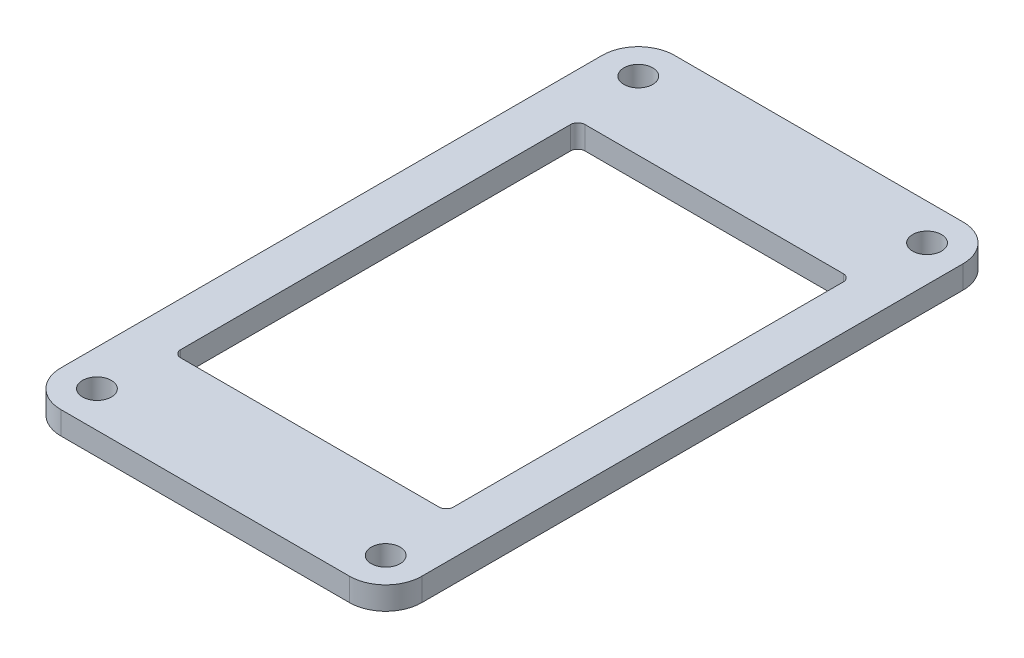
ISO-10303-21;
HEADER;
FILE_DESCRIPTION(('STEP AP214'),'2;1');
FILE_NAME('part.step','',(''),(''),'','','');
FILE_SCHEMA(('AUTOMOTIVE_DESIGN { 1 0 10303 214 1 1 1 1 }'));
ENDSEC;
DATA;
#1=APPLICATION_CONTEXT('core data for automotive mechanical design processes');
#2=APPLICATION_PROTOCOL_DEFINITION('international standard','automotive_design',2000,#1);
#3=PRODUCT_CONTEXT('',#1,'mechanical');
#4=PRODUCT('Part','Part','',(#3));
#5=PRODUCT_RELATED_PRODUCT_CATEGORY('part','',(#4));
#6=PRODUCT_DEFINITION_FORMATION('','',#4);
#7=PRODUCT_DEFINITION_CONTEXT('part definition',#1,'design');
#8=PRODUCT_DEFINITION('design','',#6,#7);
#9=PRODUCT_DEFINITION_SHAPE('','',#8);
#10=(LENGTH_UNIT() NAMED_UNIT(*) SI_UNIT(.MILLI.,.METRE.));
#11=(NAMED_UNIT(*) PLANE_ANGLE_UNIT() SI_UNIT($,.RADIAN.));
#12=(NAMED_UNIT(*) SI_UNIT($,.STERADIAN.) SOLID_ANGLE_UNIT());
#13=UNCERTAINTY_MEASURE_WITH_UNIT(LENGTH_MEASURE(1.E-05),#10,'distance_accuracy_value','');
#14=(GEOMETRIC_REPRESENTATION_CONTEXT(3) GLOBAL_UNCERTAINTY_ASSIGNED_CONTEXT((#13)) GLOBAL_UNIT_ASSIGNED_CONTEXT((#10,
#11,#12)) REPRESENTATION_CONTEXT('',''));
#15=CARTESIAN_POINT('',(0.,0.,0.));
#16=DIRECTION('',(0.,0.,1.));
#17=DIRECTION('',(1.,0.,0.));
#18=AXIS2_PLACEMENT_3D('',#15,#16,#17);
#19=CARTESIAN_POINT('',(0.,3.175,0.));
#20=DIRECTION('',(1.,0.,0.));
#21=DIRECTION('',(0.,0.,-1.));
#22=AXIS2_PLACEMENT_3D('',#19,#20,#21);
#23=PLANE('',#22);
#24=DIRECTION('',(0.,0.,1.));
#25=VECTOR('',#24,1.);
#26=CARTESIAN_POINT('',(0.,3.175,0.));
#27=LINE('',#26,#25);
#28=CARTESIAN_POINT('',(0.,3.175,-80.));
#29=VERTEX_POINT('',#28);
#30=CARTESIAN_POINT('',(0.,3.175,-5.));
#31=VERTEX_POINT('',#30);
#32=EDGE_CURVE('E238',#29,#31,#27,.T.);
#33=ORIENTED_EDGE('',*,*,#32,.F.);
#34=DIRECTION('',(0.,-1.,0.));
#35=VECTOR('',#34,1.);
#36=CARTESIAN_POINT('',(0.,3.175,-80.));
#37=LINE('',#36,#35);
#38=CARTESIAN_POINT('',(0.,0.,-80.));
#39=VERTEX_POINT('',#38);
#40=EDGE_CURVE('E308',#29,#39,#37,.T.);
#41=ORIENTED_EDGE('',*,*,#40,.T.);
#42=DIRECTION('',(0.,0.,1.));
#43=VECTOR('',#42,1.);
#44=CARTESIAN_POINT('',(0.,0.,0.));
#45=LINE('',#44,#43);
#46=CARTESIAN_POINT('',(0.,0.,-5.));
#47=VERTEX_POINT('',#46);
#48=EDGE_CURVE('E253',#39,#47,#45,.T.);
#49=ORIENTED_EDGE('',*,*,#48,.T.);
#50=DIRECTION('',(0.,-1.,0.));
#51=VECTOR('',#50,1.);
#52=CARTESIAN_POINT('',(0.,3.175,-5.));
#53=LINE('',#52,#51);
#54=EDGE_CURVE('E305',#47,#31,#53,.F.);
#55=ORIENTED_EDGE('',*,*,#54,.T.);
#56=EDGE_LOOP('',(#33,#41,#49,#55));
#57=FACE_BOUND('',#56,.T.);
#58=ADVANCED_FACE('F46',(#57),#23,.F.);
#59=CARTESIAN_POINT('',(0.,3.175,0.));
#60=DIRECTION('',(0.,0.,-1.));
#61=DIRECTION('',(-1.,0.,0.));
#62=AXIS2_PLACEMENT_3D('',#59,#60,#61);
#63=PLANE('',#62);
#64=DIRECTION('',(1.,0.,0.));
#65=VECTOR('',#64,1.);
#66=CARTESIAN_POINT('',(0.,0.,0.));
#67=LINE('',#66,#65);
#68=CARTESIAN_POINT('',(5.,0.,0.));
#69=VERTEX_POINT('',#68);
#70=CARTESIAN_POINT('',(45.,0.,0.));
#71=VERTEX_POINT('',#70);
#72=EDGE_CURVE('E257',#69,#71,#67,.T.);
#73=ORIENTED_EDGE('',*,*,#72,.T.);
#74=DIRECTION('',(0.,-1.,0.));
#75=VECTOR('',#74,1.);
#76=CARTESIAN_POINT('',(45.,3.175,0.));
#77=LINE('',#76,#75);
#78=CARTESIAN_POINT('',(45.,3.175,0.));
#79=VERTEX_POINT('',#78);
#80=EDGE_CURVE('E11',#71,#79,#77,.F.);
#81=ORIENTED_EDGE('',*,*,#80,.T.);
#82=DIRECTION('',(1.,0.,0.));
#83=VECTOR('',#82,1.);
#84=CARTESIAN_POINT('',(0.,3.175,0.));
#85=LINE('',#84,#83);
#86=CARTESIAN_POINT('',(5.,3.175,0.));
#87=VERTEX_POINT('',#86);
#88=EDGE_CURVE('E242',#87,#79,#85,.T.);
#89=ORIENTED_EDGE('',*,*,#88,.F.);
#90=DIRECTION('',(0.,-1.,0.));
#91=VECTOR('',#90,1.);
#92=CARTESIAN_POINT('',(5.,3.175,0.));
#93=LINE('',#92,#91);
#94=EDGE_CURVE('E55',#87,#69,#93,.T.);
#95=ORIENTED_EDGE('',*,*,#94,.T.);
#96=EDGE_LOOP('',(#73,#81,#89,#95));
#97=FACE_BOUND('',#96,.T.);
#98=ADVANCED_FACE('F353',(#97),#63,.F.);
#99=CARTESIAN_POINT('',(50.,3.175,0.));
#100=DIRECTION('',(-1.,0.,0.));
#101=DIRECTION('',(0.,0.,1.));
#102=AXIS2_PLACEMENT_3D('',#99,#100,#101);
#103=PLANE('',#102);
#104=DIRECTION('',(0.,0.,-1.));
#105=VECTOR('',#104,1.);
#106=CARTESIAN_POINT('',(50.,0.,0.));
#107=LINE('',#106,#105);
#108=CARTESIAN_POINT('',(50.,0.,-5.));
#109=VERTEX_POINT('',#108);
#110=CARTESIAN_POINT('',(50.,0.,-80.));
#111=VERTEX_POINT('',#110);
#112=EDGE_CURVE('E261',#109,#111,#107,.T.);
#113=ORIENTED_EDGE('',*,*,#112,.T.);
#114=DIRECTION('',(0.,-1.,0.));
#115=VECTOR('',#114,1.);
#116=CARTESIAN_POINT('',(50.,3.175,-80.));
#117=LINE('',#116,#115);
#118=CARTESIAN_POINT('',(50.,3.175,-80.));
#119=VERTEX_POINT('',#118);
#120=EDGE_CURVE('E65',#111,#119,#117,.F.);
#121=ORIENTED_EDGE('',*,*,#120,.T.);
#122=DIRECTION('',(0.,0.,-1.));
#123=VECTOR('',#122,1.);
#124=CARTESIAN_POINT('',(50.,3.175,0.));
#125=LINE('',#124,#123);
#126=CARTESIAN_POINT('',(50.,3.175,-5.));
#127=VERTEX_POINT('',#126);
#128=EDGE_CURVE('E246',#127,#119,#125,.T.);
#129=ORIENTED_EDGE('',*,*,#128,.F.);
#130=DIRECTION('',(0.,-1.,0.));
#131=VECTOR('',#130,1.);
#132=CARTESIAN_POINT('',(50.,3.175,-5.));
#133=LINE('',#132,#131);
#134=EDGE_CURVE('E342',#127,#109,#133,.T.);
#135=ORIENTED_EDGE('',*,*,#134,.T.);
#136=EDGE_LOOP('',(#113,#121,#129,#135));
#137=FACE_BOUND('',#136,.T.);
#138=ADVANCED_FACE('F364',(#137),#103,.F.);
#139=CARTESIAN_POINT('',(0.,3.175,-85.));
#140=DIRECTION('',(0.,0.,1.));
#141=DIRECTION('',(1.,0.,0.));
#142=AXIS2_PLACEMENT_3D('',#139,#140,#141);
#143=PLANE('',#142);
#144=DIRECTION('',(-1.,0.,0.));
#145=VECTOR('',#144,1.);
#146=CARTESIAN_POINT('',(0.,0.,-85.));
#147=LINE('',#146,#145);
#148=CARTESIAN_POINT('',(45.,0.,-85.));
#149=VERTEX_POINT('',#148);
#150=CARTESIAN_POINT('',(5.,0.,-85.));
#151=VERTEX_POINT('',#150);
#152=EDGE_CURVE('E243',#149,#151,#147,.T.);
#153=ORIENTED_EDGE('',*,*,#152,.T.);
#154=DIRECTION('',(0.,-1.,0.));
#155=VECTOR('',#154,1.);
#156=CARTESIAN_POINT('',(5.,3.175,-85.));
#157=LINE('',#156,#155);
#158=CARTESIAN_POINT('',(5.,3.175,-85.));
#159=VERTEX_POINT('',#158);
#160=EDGE_CURVE('E328',#151,#159,#157,.F.);
#161=ORIENTED_EDGE('',*,*,#160,.T.);
#162=DIRECTION('',(-1.,0.,0.));
#163=VECTOR('',#162,1.);
#164=CARTESIAN_POINT('',(0.,3.175,-85.));
#165=LINE('',#164,#163);
#166=CARTESIAN_POINT('',(45.,3.175,-85.));
#167=VERTEX_POINT('',#166);
#168=EDGE_CURVE('E249',#167,#159,#165,.T.);
#169=ORIENTED_EDGE('',*,*,#168,.F.);
#170=DIRECTION('',(0.,-1.,0.));
#171=VECTOR('',#170,1.);
#172=CARTESIAN_POINT('',(45.,3.175,-85.));
#173=LINE('',#172,#171);
#174=EDGE_CURVE('E324',#167,#149,#173,.T.);
#175=ORIENTED_EDGE('',*,*,#174,.T.);
#176=EDGE_LOOP('',(#153,#161,#169,#175));
#177=FACE_BOUND('',#176,.T.);
#178=ADVANCED_FACE('F372',(#177),#143,.F.);
#179=CARTESIAN_POINT('',(0.,3.175,0.));
#180=DIRECTION('',(0.,-1.,0.));
#181=DIRECTION('',(0.,0.,-1.));
#182=AXIS2_PLACEMENT_3D('',#179,#180,#181);
#183=PLANE('',#182);
#184=CARTESIAN_POINT('',(5.,3.175,-80.));
#185=DIRECTION('',(0.,1.,0.));
#186=DIRECTION('',(0.,0.,1.));
#187=AXIS2_PLACEMENT_3D('',#184,#185,#186);
#188=CIRCLE('',#187,2.);
#189=CARTESIAN_POINT('',(5.,3.175,-78.));
#190=VERTEX_POINT('',#189);
#191=EDGE_CURVE('E716',#190,#190,#188,.T.);
#192=ORIENTED_EDGE('',*,*,#191,.F.);
#193=EDGE_LOOP('',(#192));
#194=FACE_BOUND('',#193,.T.);
#195=CARTESIAN_POINT('',(45.,3.175,-80.));
#196=DIRECTION('',(0.,1.,0.));
#197=DIRECTION('',(0.,0.,1.));
#198=AXIS2_PLACEMENT_3D('',#195,#196,#197);
#199=CIRCLE('',#198,2.);
#200=CARTESIAN_POINT('',(45.,3.175,-78.));
#201=VERTEX_POINT('',#200);
#202=EDGE_CURVE('E724',#201,#201,#199,.T.);
#203=ORIENTED_EDGE('',*,*,#202,.F.);
#204=EDGE_LOOP('',(#203));
#205=FACE_BOUND('',#204,.T.);
#206=CARTESIAN_POINT('',(45.,3.175,-5.));
#207=DIRECTION('',(0.,1.,0.));
#208=DIRECTION('',(0.,0.,1.));
#209=AXIS2_PLACEMENT_3D('',#206,#207,#208);
#210=CIRCLE('',#209,2.);
#211=CARTESIAN_POINT('',(45.,3.175,-3.));
#212=VERTEX_POINT('',#211);
#213=EDGE_CURVE('E709',#212,#212,#210,.T.);
#214=ORIENTED_EDGE('',*,*,#213,.F.);
#215=EDGE_LOOP('',(#214));
#216=FACE_BOUND('',#215,.T.);
#217=CARTESIAN_POINT('',(5.,3.175,-5.));
#218=DIRECTION('',(0.,1.,0.));
#219=DIRECTION('',(0.,0.,1.));
#220=AXIS2_PLACEMENT_3D('',#217,#218,#219);
#221=CIRCLE('',#220,2.);
#222=CARTESIAN_POINT('',(5.,3.175,-3.));
#223=VERTEX_POINT('',#222);
#224=EDGE_CURVE('E703',#223,#223,#221,.T.);
#225=ORIENTED_EDGE('',*,*,#224,.F.);
#226=EDGE_LOOP('',(#225));
#227=FACE_BOUND('',#226,.T.);
#228=DIRECTION('',(1.,0.,0.));
#229=VECTOR('',#228,1.);
#230=CARTESIAN_POINT('',(6.109,3.175,-14.498));
#231=LINE('',#230,#229);
#232=CARTESIAN_POINT('',(7.109,3.175,-14.498));
#233=VERTEX_POINT('',#232);
#234=CARTESIAN_POINT('',(42.891,3.175,-14.498));
#235=VERTEX_POINT('',#234);
#236=EDGE_CURVE('E234',#233,#235,#231,.T.);
#237=ORIENTED_EDGE('',*,*,#236,.F.);
#238=CARTESIAN_POINT('',(7.109,3.175,-15.498));
#239=DIRECTION('',(0.,-1.,0.));
#240=DIRECTION('',(0.,0.,-1.));
#241=AXIS2_PLACEMENT_3D('',#238,#239,#240);
#242=CIRCLE('',#241,1.);
#243=CARTESIAN_POINT('',(6.109,3.175,-15.498));
#244=VERTEX_POINT('',#243);
#245=EDGE_CURVE('E295',#233,#244,#242,.T.);
#246=ORIENTED_EDGE('',*,*,#245,.T.);
#247=DIRECTION('',(0.,0.,1.));
#248=VECTOR('',#247,1.);
#249=CARTESIAN_POINT('',(6.109,3.175,-14.498));
#250=LINE('',#249,#248);
#251=CARTESIAN_POINT('',(6.109,3.175,-69.502));
#252=VERTEX_POINT('',#251);
#253=EDGE_CURVE('E684',#252,#244,#250,.T.);
#254=ORIENTED_EDGE('',*,*,#253,.F.);
#255=CARTESIAN_POINT('',(7.109,3.175,-69.502));
#256=DIRECTION('',(0.,-1.,0.));
#257=DIRECTION('',(0.,0.,-1.));
#258=AXIS2_PLACEMENT_3D('',#255,#256,#257);
#259=CIRCLE('',#258,1.);
#260=CARTESIAN_POINT('',(7.109,3.175,-70.502));
#261=VERTEX_POINT('',#260);
#262=EDGE_CURVE('E222',#252,#261,#259,.T.);
#263=ORIENTED_EDGE('',*,*,#262,.T.);
#264=DIRECTION('',(-1.,0.,0.));
#265=VECTOR('',#264,1.);
#266=CARTESIAN_POINT('',(6.109,3.175,-70.502));
#267=LINE('',#266,#265);
#268=CARTESIAN_POINT('',(42.891,3.175,-70.502));
#269=VERTEX_POINT('',#268);
#270=EDGE_CURVE('E211',#269,#261,#267,.T.);
#271=ORIENTED_EDGE('',*,*,#270,.F.);
#272=CARTESIAN_POINT('',(42.891,3.175,-69.502));
#273=DIRECTION('',(0.,-1.,0.));
#274=DIRECTION('',(0.,0.,-1.));
#275=AXIS2_PLACEMENT_3D('',#272,#273,#274);
#276=CIRCLE('',#275,1.);
#277=CARTESIAN_POINT('',(43.891,3.175,-69.502));
#278=VERTEX_POINT('',#277);
#279=EDGE_CURVE('E193',#269,#278,#276,.T.);
#280=ORIENTED_EDGE('',*,*,#279,.T.);
#281=DIRECTION('',(0.,0.,-1.));
#282=VECTOR('',#281,1.);
#283=CARTESIAN_POINT('',(43.891,3.175,-14.498));
#284=LINE('',#283,#282);
#285=CARTESIAN_POINT('',(43.891,3.175,-15.498));
#286=VERTEX_POINT('',#285);
#287=EDGE_CURVE('E225',#286,#278,#284,.T.);
#288=ORIENTED_EDGE('',*,*,#287,.F.);
#289=CARTESIAN_POINT('',(42.891,3.175,-15.498));
#290=DIRECTION('',(0.,-1.,0.));
#291=DIRECTION('',(0.,0.,-1.));
#292=AXIS2_PLACEMENT_3D('',#289,#290,#291);
#293=CIRCLE('',#292,1.);
#294=EDGE_CURVE('E289',#286,#235,#293,.T.);
#295=ORIENTED_EDGE('',*,*,#294,.T.);
#296=EDGE_LOOP('',(#237,#246,#254,#263,#271,#280,#288,#295));
#297=FACE_BOUND('',#296,.T.);
#298=ORIENTED_EDGE('',*,*,#168,.T.);
#299=CARTESIAN_POINT('',(5.,3.175,-80.));
#300=DIRECTION('',(0.,-1.,0.));
#301=DIRECTION('',(0.,0.,-1.));
#302=AXIS2_PLACEMENT_3D('',#299,#300,#301);
#303=CIRCLE('',#302,5.);
#304=EDGE_CURVE('E339',#159,#29,#303,.F.);
#305=ORIENTED_EDGE('',*,*,#304,.T.);
#306=ORIENTED_EDGE('',*,*,#32,.T.);
#307=CARTESIAN_POINT('',(5.,3.175,-5.));
#308=DIRECTION('',(0.,-1.,0.));
#309=DIRECTION('',(0.,0.,-1.));
#310=AXIS2_PLACEMENT_3D('',#307,#308,#309);
#311=CIRCLE('',#310,5.);
#312=EDGE_CURVE('E331',#31,#87,#311,.F.);
#313=ORIENTED_EDGE('',*,*,#312,.T.);
#314=ORIENTED_EDGE('',*,*,#88,.T.);
#315=CARTESIAN_POINT('',(45.,3.175,-5.));
#316=DIRECTION('',(0.,-1.,0.));
#317=DIRECTION('',(0.,0.,-1.));
#318=AXIS2_PLACEMENT_3D('',#315,#316,#317);
#319=CIRCLE('',#318,5.);
#320=EDGE_CURVE('E75',#79,#127,#319,.F.);
#321=ORIENTED_EDGE('',*,*,#320,.T.);
#322=ORIENTED_EDGE('',*,*,#128,.T.);
#323=CARTESIAN_POINT('',(45.,3.175,-80.));
#324=DIRECTION('',(0.,-1.,0.));
#325=DIRECTION('',(0.,0.,-1.));
#326=AXIS2_PLACEMENT_3D('',#323,#324,#325);
#327=CIRCLE('',#326,5.);
#328=EDGE_CURVE('E336',#119,#167,#327,.F.);
#329=ORIENTED_EDGE('',*,*,#328,.T.);
#330=EDGE_LOOP('',(#298,#305,#306,#313,#314,#321,#322,#329));
#331=FACE_BOUND('',#330,.T.);
#332=ADVANCED_FACE('F220',(#194,#205,#216,#227,#297,#331),#183,.F.);
#333=CARTESIAN_POINT('',(0.,0.,0.));
#334=DIRECTION('',(0.,-1.,0.));
#335=DIRECTION('',(0.,0.,-1.));
#336=AXIS2_PLACEMENT_3D('',#333,#334,#335);
#337=PLANE('',#336);
#338=CARTESIAN_POINT('',(5.,0.,-80.));
#339=DIRECTION('',(0.,1.,0.));
#340=DIRECTION('',(0.,0.,1.));
#341=AXIS2_PLACEMENT_3D('',#338,#339,#340);
#342=CIRCLE('',#341,2.);
#343=CARTESIAN_POINT('',(5.,0.,-78.));
#344=VERTEX_POINT('',#343);
#345=EDGE_CURVE('E712',#344,#344,#342,.T.);
#346=ORIENTED_EDGE('',*,*,#345,.T.);
#347=EDGE_LOOP('',(#346));
#348=FACE_BOUND('',#347,.T.);
#349=CARTESIAN_POINT('',(45.,0.,-80.));
#350=DIRECTION('',(0.,1.,0.));
#351=DIRECTION('',(0.,0.,1.));
#352=AXIS2_PLACEMENT_3D('',#349,#350,#351);
#353=CIRCLE('',#352,2.);
#354=CARTESIAN_POINT('',(45.,0.,-78.));
#355=VERTEX_POINT('',#354);
#356=EDGE_CURVE('E720',#355,#355,#353,.T.);
#357=ORIENTED_EDGE('',*,*,#356,.T.);
#358=EDGE_LOOP('',(#357));
#359=FACE_BOUND('',#358,.T.);
#360=CARTESIAN_POINT('',(45.,0.,-5.));
#361=DIRECTION('',(0.,1.,0.));
#362=DIRECTION('',(0.,0.,1.));
#363=AXIS2_PLACEMENT_3D('',#360,#361,#362);
#364=CIRCLE('',#363,2.);
#365=CARTESIAN_POINT('',(45.,0.,-3.));
#366=VERTEX_POINT('',#365);
#367=EDGE_CURVE('E728',#366,#366,#364,.T.);
#368=ORIENTED_EDGE('',*,*,#367,.T.);
#369=EDGE_LOOP('',(#368));
#370=FACE_BOUND('',#369,.T.);
#371=CARTESIAN_POINT('',(5.,0.,-5.));
#372=DIRECTION('',(0.,1.,0.));
#373=DIRECTION('',(0.,0.,1.));
#374=AXIS2_PLACEMENT_3D('',#371,#372,#373);
#375=CIRCLE('',#374,2.);
#376=CARTESIAN_POINT('',(5.,0.,-3.));
#377=VERTEX_POINT('',#376);
#378=EDGE_CURVE('E699',#377,#377,#375,.T.);
#379=ORIENTED_EDGE('',*,*,#378,.T.);
#380=EDGE_LOOP('',(#379));
#381=FACE_BOUND('',#380,.T.);
#382=DIRECTION('',(-1.,0.,0.));
#383=VECTOR('',#382,1.);
#384=CARTESIAN_POINT('',(6.109,0.,-70.502));
#385=LINE('',#384,#383);
#386=CARTESIAN_POINT('',(42.891,0.,-70.502));
#387=VERTEX_POINT('',#386);
#388=CARTESIAN_POINT('',(7.109,0.,-70.502));
#389=VERTEX_POINT('',#388);
#390=EDGE_CURVE('E214',#387,#389,#385,.T.);
#391=ORIENTED_EDGE('',*,*,#390,.T.);
#392=CARTESIAN_POINT('',(7.109,0.,-69.502));
#393=DIRECTION('',(0.,-1.,0.));
#394=DIRECTION('',(0.,0.,-1.));
#395=AXIS2_PLACEMENT_3D('',#392,#393,#394);
#396=CIRCLE('',#395,1.);
#397=CARTESIAN_POINT('',(6.109,0.,-69.502));
#398=VERTEX_POINT('',#397);
#399=EDGE_CURVE('E302',#389,#398,#396,.F.);
#400=ORIENTED_EDGE('',*,*,#399,.T.);
#401=DIRECTION('',(0.,0.,1.));
#402=VECTOR('',#401,1.);
#403=CARTESIAN_POINT('',(6.109,0.,-14.498));
#404=LINE('',#403,#402);
#405=CARTESIAN_POINT('',(6.109,0.,-15.498));
#406=VERTEX_POINT('',#405);
#407=EDGE_CURVE('E224',#398,#406,#404,.T.);
#408=ORIENTED_EDGE('',*,*,#407,.T.);
#409=CARTESIAN_POINT('',(7.109,0.,-15.498));
#410=DIRECTION('',(0.,-1.,0.));
#411=DIRECTION('',(0.,0.,-1.));
#412=AXIS2_PLACEMENT_3D('',#409,#410,#411);
#413=CIRCLE('',#412,1.);
#414=CARTESIAN_POINT('',(7.109,0.,-14.498));
#415=VERTEX_POINT('',#414);
#416=EDGE_CURVE('E298',#406,#415,#413,.F.);
#417=ORIENTED_EDGE('',*,*,#416,.T.);
#418=DIRECTION('',(1.,0.,0.));
#419=VECTOR('',#418,1.);
#420=CARTESIAN_POINT('',(6.109,0.,-14.498));
#421=LINE('',#420,#419);
#422=CARTESIAN_POINT('',(42.891,0.,-14.498));
#423=VERTEX_POINT('',#422);
#424=EDGE_CURVE('E231',#415,#423,#421,.T.);
#425=ORIENTED_EDGE('',*,*,#424,.T.);
#426=CARTESIAN_POINT('',(42.891,0.,-15.498));
#427=DIRECTION('',(0.,-1.,0.));
#428=DIRECTION('',(0.,0.,-1.));
#429=AXIS2_PLACEMENT_3D('',#426,#427,#428);
#430=CIRCLE('',#429,1.);
#431=CARTESIAN_POINT('',(43.891,0.,-15.498));
#432=VERTEX_POINT('',#431);
#433=EDGE_CURVE('E292',#423,#432,#430,.F.);
#434=ORIENTED_EDGE('',*,*,#433,.T.);
#435=DIRECTION('',(0.,0.,-1.));
#436=VECTOR('',#435,1.);
#437=CARTESIAN_POINT('',(43.891,0.,-14.498));
#438=LINE('',#437,#436);
#439=CARTESIAN_POINT('',(43.891,0.,-69.502));
#440=VERTEX_POINT('',#439);
#441=EDGE_CURVE('E690',#432,#440,#438,.T.);
#442=ORIENTED_EDGE('',*,*,#441,.T.);
#443=CARTESIAN_POINT('',(42.891,0.,-69.502));
#444=DIRECTION('',(0.,-1.,0.));
#445=DIRECTION('',(0.,0.,-1.));
#446=AXIS2_PLACEMENT_3D('',#443,#444,#445);
#447=CIRCLE('',#446,1.);
#448=EDGE_CURVE('E204',#440,#387,#447,.F.);
#449=ORIENTED_EDGE('',*,*,#448,.T.);
#450=EDGE_LOOP('',(#391,#400,#408,#417,#425,#434,#442,#449));
#451=FACE_BOUND('',#450,.T.);
#452=ORIENTED_EDGE('',*,*,#48,.F.);
#453=CARTESIAN_POINT('',(5.,0.,-80.));
#454=DIRECTION('',(0.,-1.,0.));
#455=DIRECTION('',(0.,0.,-1.));
#456=AXIS2_PLACEMENT_3D('',#453,#454,#455);
#457=CIRCLE('',#456,5.);
#458=EDGE_CURVE('E321',#39,#151,#457,.T.);
#459=ORIENTED_EDGE('',*,*,#458,.T.);
#460=ORIENTED_EDGE('',*,*,#152,.F.);
#461=CARTESIAN_POINT('',(45.,0.,-80.));
#462=DIRECTION('',(0.,-1.,0.));
#463=DIRECTION('',(0.,0.,-1.));
#464=AXIS2_PLACEMENT_3D('',#461,#462,#463);
#465=CIRCLE('',#464,5.);
#466=EDGE_CURVE('E318',#149,#111,#465,.T.);
#467=ORIENTED_EDGE('',*,*,#466,.T.);
#468=ORIENTED_EDGE('',*,*,#112,.F.);
#469=CARTESIAN_POINT('',(45.,0.,-5.));
#470=DIRECTION('',(0.,-1.,0.));
#471=DIRECTION('',(0.,0.,-1.));
#472=AXIS2_PLACEMENT_3D('',#469,#470,#471);
#473=CIRCLE('',#472,5.);
#474=EDGE_CURVE('E315',#109,#71,#473,.T.);
#475=ORIENTED_EDGE('',*,*,#474,.T.);
#476=ORIENTED_EDGE('',*,*,#72,.F.);
#477=CARTESIAN_POINT('',(5.,0.,-5.));
#478=DIRECTION('',(0.,-1.,0.));
#479=DIRECTION('',(0.,0.,-1.));
#480=AXIS2_PLACEMENT_3D('',#477,#478,#479);
#481=CIRCLE('',#480,5.);
#482=EDGE_CURVE('E312',#69,#47,#481,.T.);
#483=ORIENTED_EDGE('',*,*,#482,.T.);
#484=EDGE_LOOP('',(#452,#459,#460,#467,#468,#475,#476,#483));
#485=FACE_BOUND('',#484,.T.);
#486=ADVANCED_FACE('F359',(#348,#359,#370,#381,#451,#485),#337,.T.);
#487=CARTESIAN_POINT('',(6.109,0.,-14.498));
#488=DIRECTION('',(-1.,0.,0.));
#489=DIRECTION('',(0.,0.,1.));
#490=AXIS2_PLACEMENT_3D('',#487,#488,#489);
#491=PLANE('',#490);
#492=ORIENTED_EDGE('',*,*,#253,.T.);
#493=DIRECTION('',(0.,1.,0.));
#494=VECTOR('',#493,1.);
#495=CARTESIAN_POINT('',(6.109,0.,-15.498));
#496=LINE('',#495,#494);
#497=EDGE_CURVE('E205',#244,#406,#496,.F.);
#498=ORIENTED_EDGE('',*,*,#497,.T.);
#499=ORIENTED_EDGE('',*,*,#407,.F.);
#500=DIRECTION('',(0.,1.,0.));
#501=VECTOR('',#500,1.);
#502=CARTESIAN_POINT('',(6.109,3.175,-69.502));
#503=LINE('',#502,#501);
#504=EDGE_CURVE('E281',#398,#252,#503,.T.);
#505=ORIENTED_EDGE('',*,*,#504,.T.);
#506=EDGE_LOOP('',(#492,#498,#499,#505));
#507=FACE_BOUND('',#506,.T.);
#508=ADVANCED_FACE('F484',(#507),#491,.F.);
#509=CARTESIAN_POINT('',(6.109,0.,-70.502));
#510=DIRECTION('',(0.,0.,-1.));
#511=DIRECTION('',(-1.,0.,0.));
#512=AXIS2_PLACEMENT_3D('',#509,#510,#511);
#513=PLANE('',#512);
#514=ORIENTED_EDGE('',*,*,#390,.F.);
#515=DIRECTION('',(0.,1.,0.));
#516=VECTOR('',#515,1.);
#517=CARTESIAN_POINT('',(42.891,3.175,-70.502));
#518=LINE('',#517,#516);
#519=EDGE_CURVE('E197',#387,#269,#518,.T.);
#520=ORIENTED_EDGE('',*,*,#519,.T.);
#521=ORIENTED_EDGE('',*,*,#270,.T.);
#522=DIRECTION('',(0.,1.,0.));
#523=VECTOR('',#522,1.);
#524=CARTESIAN_POINT('',(7.109,0.,-70.502));
#525=LINE('',#524,#523);
#526=EDGE_CURVE('E217',#261,#389,#525,.F.);
#527=ORIENTED_EDGE('',*,*,#526,.T.);
#528=EDGE_LOOP('',(#514,#520,#521,#527));
#529=FACE_BOUND('',#528,.T.);
#530=ADVANCED_FACE('F210',(#529),#513,.F.);
#531=CARTESIAN_POINT('',(43.891,0.,-14.498));
#532=DIRECTION('',(1.,0.,0.));
#533=DIRECTION('',(0.,0.,-1.));
#534=AXIS2_PLACEMENT_3D('',#531,#532,#533);
#535=PLANE('',#534);
#536=ORIENTED_EDGE('',*,*,#287,.T.);
#537=DIRECTION('',(0.,1.,0.));
#538=VECTOR('',#537,1.);
#539=CARTESIAN_POINT('',(43.891,0.,-69.502));
#540=LINE('',#539,#538);
#541=EDGE_CURVE('E198',#278,#440,#540,.F.);
#542=ORIENTED_EDGE('',*,*,#541,.T.);
#543=ORIENTED_EDGE('',*,*,#441,.F.);
#544=DIRECTION('',(0.,1.,0.));
#545=VECTOR('',#544,1.);
#546=CARTESIAN_POINT('',(43.891,3.175,-15.498));
#547=LINE('',#546,#545);
#548=EDGE_CURVE('E216',#432,#286,#547,.T.);
#549=ORIENTED_EDGE('',*,*,#548,.T.);
#550=EDGE_LOOP('',(#536,#542,#543,#549));
#551=FACE_BOUND('',#550,.T.);
#552=ADVANCED_FACE('F483',(#551),#535,.F.);
#553=CARTESIAN_POINT('',(6.109,0.,-14.498));
#554=DIRECTION('',(0.,0.,1.));
#555=DIRECTION('',(1.,0.,0.));
#556=AXIS2_PLACEMENT_3D('',#553,#554,#555);
#557=PLANE('',#556);
#558=ORIENTED_EDGE('',*,*,#236,.T.);
#559=DIRECTION('',(0.,1.,0.));
#560=VECTOR('',#559,1.);
#561=CARTESIAN_POINT('',(42.891,0.,-14.498));
#562=LINE('',#561,#560);
#563=EDGE_CURVE('E278',#235,#423,#562,.F.);
#564=ORIENTED_EDGE('',*,*,#563,.T.);
#565=ORIENTED_EDGE('',*,*,#424,.F.);
#566=DIRECTION('',(0.,1.,0.));
#567=VECTOR('',#566,1.);
#568=CARTESIAN_POINT('',(7.109,3.175,-14.498));
#569=LINE('',#568,#567);
#570=EDGE_CURVE('E274',#415,#233,#569,.T.);
#571=ORIENTED_EDGE('',*,*,#570,.T.);
#572=EDGE_LOOP('',(#558,#564,#565,#571));
#573=FACE_BOUND('',#572,.T.);
#574=ADVANCED_FACE('F401',(#573),#557,.F.);
#575=CARTESIAN_POINT('',(42.891,0.,-69.502));
#576=DIRECTION('',(0.,-1.,0.));
#577=DIRECTION('',(0.,0.,-1.));
#578=AXIS2_PLACEMENT_3D('',#575,#576,#577);
#579=CYLINDRICAL_SURFACE('',#578,1.);
#580=ORIENTED_EDGE('',*,*,#448,.F.);
#581=ORIENTED_EDGE('',*,*,#541,.F.);
#582=ORIENTED_EDGE('',*,*,#279,.F.);
#583=ORIENTED_EDGE('',*,*,#519,.F.);
#584=EDGE_LOOP('',(#580,#581,#582,#583));
#585=FACE_BOUND('',#584,.T.);
#586=ADVANCED_FACE('F196',(#585),#579,.F.);
#587=CARTESIAN_POINT('',(42.891,0.,-15.498));
#588=DIRECTION('',(0.,-1.,0.));
#589=DIRECTION('',(0.,0.,-1.));
#590=AXIS2_PLACEMENT_3D('',#587,#588,#589);
#591=CYLINDRICAL_SURFACE('',#590,1.);
#592=ORIENTED_EDGE('',*,*,#433,.F.);
#593=ORIENTED_EDGE('',*,*,#563,.F.);
#594=ORIENTED_EDGE('',*,*,#294,.F.);
#595=ORIENTED_EDGE('',*,*,#548,.F.);
#596=EDGE_LOOP('',(#592,#593,#594,#595));
#597=FACE_BOUND('',#596,.T.);
#598=ADVANCED_FACE('F400',(#597),#591,.F.);
#599=CARTESIAN_POINT('',(7.109,0.,-15.498));
#600=DIRECTION('',(0.,-1.,0.));
#601=DIRECTION('',(0.,0.,-1.));
#602=AXIS2_PLACEMENT_3D('',#599,#600,#601);
#603=CYLINDRICAL_SURFACE('',#602,1.);
#604=ORIENTED_EDGE('',*,*,#416,.F.);
#605=ORIENTED_EDGE('',*,*,#497,.F.);
#606=ORIENTED_EDGE('',*,*,#245,.F.);
#607=ORIENTED_EDGE('',*,*,#570,.F.);
#608=EDGE_LOOP('',(#604,#605,#606,#607));
#609=FACE_BOUND('',#608,.T.);
#610=ADVANCED_FACE('F404',(#609),#603,.F.);
#611=CARTESIAN_POINT('',(7.109,0.,-69.502));
#612=DIRECTION('',(0.,-1.,0.));
#613=DIRECTION('',(0.,0.,-1.));
#614=AXIS2_PLACEMENT_3D('',#611,#612,#613);
#615=CYLINDRICAL_SURFACE('',#614,1.);
#616=ORIENTED_EDGE('',*,*,#399,.F.);
#617=ORIENTED_EDGE('',*,*,#526,.F.);
#618=ORIENTED_EDGE('',*,*,#262,.F.);
#619=ORIENTED_EDGE('',*,*,#504,.F.);
#620=EDGE_LOOP('',(#616,#617,#618,#619));
#621=FACE_BOUND('',#620,.T.);
#622=ADVANCED_FACE('F408',(#621),#615,.F.);
#623=CARTESIAN_POINT('',(5.,3.175,-80.));
#624=DIRECTION('',(0.,-1.,0.));
#625=DIRECTION('',(0.,0.,-1.));
#626=AXIS2_PLACEMENT_3D('',#623,#624,#625);
#627=CYLINDRICAL_SURFACE('',#626,5.);
#628=ORIENTED_EDGE('',*,*,#304,.F.);
#629=ORIENTED_EDGE('',*,*,#160,.F.);
#630=ORIENTED_EDGE('',*,*,#458,.F.);
#631=ORIENTED_EDGE('',*,*,#40,.F.);
#632=EDGE_LOOP('',(#628,#629,#630,#631));
#633=FACE_BOUND('',#632,.T.);
#634=ADVANCED_FACE('F377',(#633),#627,.T.);
#635=CARTESIAN_POINT('',(45.,3.175,-80.));
#636=DIRECTION('',(0.,-1.,0.));
#637=DIRECTION('',(0.,0.,-1.));
#638=AXIS2_PLACEMENT_3D('',#635,#636,#637);
#639=CYLINDRICAL_SURFACE('',#638,5.);
#640=ORIENTED_EDGE('',*,*,#328,.F.);
#641=ORIENTED_EDGE('',*,*,#120,.F.);
#642=ORIENTED_EDGE('',*,*,#466,.F.);
#643=ORIENTED_EDGE('',*,*,#174,.F.);
#644=EDGE_LOOP('',(#640,#641,#642,#643));
#645=FACE_BOUND('',#644,.T.);
#646=ADVANCED_FACE('F369',(#645),#639,.T.);
#647=CARTESIAN_POINT('',(45.,3.175,-5.));
#648=DIRECTION('',(0.,-1.,0.));
#649=DIRECTION('',(0.,0.,-1.));
#650=AXIS2_PLACEMENT_3D('',#647,#648,#649);
#651=CYLINDRICAL_SURFACE('',#650,5.);
#652=ORIENTED_EDGE('',*,*,#320,.F.);
#653=ORIENTED_EDGE('',*,*,#80,.F.);
#654=ORIENTED_EDGE('',*,*,#474,.F.);
#655=ORIENTED_EDGE('',*,*,#134,.F.);
#656=EDGE_LOOP('',(#652,#653,#654,#655));
#657=FACE_BOUND('',#656,.T.);
#658=ADVANCED_FACE('F363',(#657),#651,.T.);
#659=CARTESIAN_POINT('',(5.,3.175,-5.));
#660=DIRECTION('',(0.,-1.,0.));
#661=DIRECTION('',(0.,0.,-1.));
#662=AXIS2_PLACEMENT_3D('',#659,#660,#661);
#663=CYLINDRICAL_SURFACE('',#662,5.);
#664=ORIENTED_EDGE('',*,*,#312,.F.);
#665=ORIENTED_EDGE('',*,*,#54,.F.);
#666=ORIENTED_EDGE('',*,*,#482,.F.);
#667=ORIENTED_EDGE('',*,*,#94,.F.);
#668=EDGE_LOOP('',(#664,#665,#666,#667));
#669=FACE_BOUND('',#668,.T.);
#670=ADVANCED_FACE('F48',(#669),#663,.T.);
#671=CARTESIAN_POINT('',(5.,0.,-5.));
#672=DIRECTION('',(0.,1.,0.));
#673=DIRECTION('',(0.,0.,1.));
#674=AXIS2_PLACEMENT_3D('',#671,#672,#673);
#675=CYLINDRICAL_SURFACE('',#674,2.);
#676=ORIENTED_EDGE('',*,*,#378,.F.);
#677=EDGE_LOOP('',(#676));
#678=FACE_BOUND('',#677,.T.);
#679=ORIENTED_EDGE('',*,*,#224,.T.);
#680=EDGE_LOOP('',(#679));
#681=FACE_BOUND('',#680,.T.);
#682=ADVANCED_FACE('F382',(#678,#681),#675,.F.);
#683=CARTESIAN_POINT('',(45.,0.,-5.));
#684=DIRECTION('',(0.,1.,0.));
#685=DIRECTION('',(0.,0.,1.));
#686=AXIS2_PLACEMENT_3D('',#683,#684,#685);
#687=CYLINDRICAL_SURFACE('',#686,2.);
#688=ORIENTED_EDGE('',*,*,#367,.F.);
#689=EDGE_LOOP('',(#688));
#690=FACE_BOUND('',#689,.T.);
#691=ORIENTED_EDGE('',*,*,#213,.T.);
#692=EDGE_LOOP('',(#691));
#693=FACE_BOUND('',#692,.T.);
#694=ADVANCED_FACE('F387',(#690,#693),#687,.F.);
#695=CARTESIAN_POINT('',(45.,0.,-80.));
#696=DIRECTION('',(0.,1.,0.));
#697=DIRECTION('',(0.,0.,1.));
#698=AXIS2_PLACEMENT_3D('',#695,#696,#697);
#699=CYLINDRICAL_SURFACE('',#698,2.);
#700=ORIENTED_EDGE('',*,*,#356,.F.);
#701=EDGE_LOOP('',(#700));
#702=FACE_BOUND('',#701,.T.);
#703=ORIENTED_EDGE('',*,*,#202,.T.);
#704=EDGE_LOOP('',(#703));
#705=FACE_BOUND('',#704,.T.);
#706=ADVANCED_FACE('F446',(#702,#705),#699,.F.);
#707=CARTESIAN_POINT('',(5.,0.,-80.));
#708=DIRECTION('',(0.,1.,0.));
#709=DIRECTION('',(0.,0.,1.));
#710=AXIS2_PLACEMENT_3D('',#707,#708,#709);
#711=CYLINDRICAL_SURFACE('',#710,2.);
#712=ORIENTED_EDGE('',*,*,#345,.F.);
#713=EDGE_LOOP('',(#712));
#714=FACE_BOUND('',#713,.T.);
#715=ORIENTED_EDGE('',*,*,#191,.T.);
#716=EDGE_LOOP('',(#715));
#717=FACE_BOUND('',#716,.T.);
#718=ADVANCED_FACE('F456',(#714,#717),#711,.F.);
#719=CLOSED_SHELL('',(#58,#98,#138,#178,#332,#486,#508,#530,#552,#574,#586,#598,#610,#622,#634,
#646,#658,#670,#682,#694,#706,#718));
#720=MANIFOLD_SOLID_BREP('B2',#719);
#721=ADVANCED_BREP_SHAPE_REPRESENTATION('',(#18,#720),#14);
#722=SHAPE_DEFINITION_REPRESENTATION(#9,#721);
ENDSEC;
END-ISO-10303-21;
